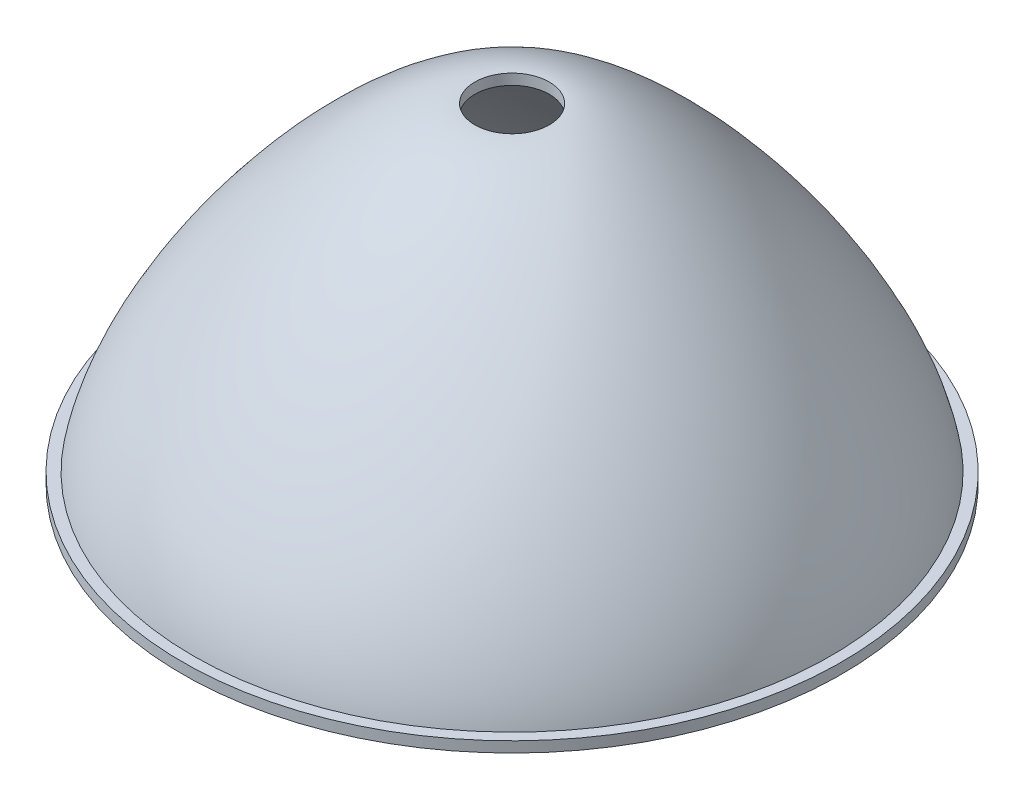
ISO-10303-21;
HEADER;
FILE_DESCRIPTION(('STEP AP214'),'2;1');
FILE_NAME('part.step','',(''),(''),'','','');
FILE_SCHEMA(('AUTOMOTIVE_DESIGN { 1 0 10303 214 1 1 1 1 }'));
ENDSEC;
DATA;
#1=APPLICATION_CONTEXT('core data for automotive mechanical design processes');
#2=APPLICATION_PROTOCOL_DEFINITION('international standard','automotive_design',2000,#1);
#3=PRODUCT_CONTEXT('',#1,'mechanical');
#4=PRODUCT('Part','Part','',(#3));
#5=PRODUCT_RELATED_PRODUCT_CATEGORY('part','',(#4));
#6=PRODUCT_DEFINITION_FORMATION('','',#4);
#7=PRODUCT_DEFINITION_CONTEXT('part definition',#1,'design');
#8=PRODUCT_DEFINITION('design','',#6,#7);
#9=PRODUCT_DEFINITION_SHAPE('','',#8);
#10=(LENGTH_UNIT() NAMED_UNIT(*) SI_UNIT(.MILLI.,.METRE.));
#11=(NAMED_UNIT(*) PLANE_ANGLE_UNIT() SI_UNIT($,.RADIAN.));
#12=(NAMED_UNIT(*) SI_UNIT($,.STERADIAN.) SOLID_ANGLE_UNIT());
#13=UNCERTAINTY_MEASURE_WITH_UNIT(LENGTH_MEASURE(1.E-05),#10,'distance_accuracy_value','');
#14=(GEOMETRIC_REPRESENTATION_CONTEXT(3) GLOBAL_UNCERTAINTY_ASSIGNED_CONTEXT((#13)) GLOBAL_UNIT_ASSIGNED_CONTEXT((#10,
#11,#12)) REPRESENTATION_CONTEXT('',''));
#15=CARTESIAN_POINT('',(0.,0.,0.));
#16=DIRECTION('',(0.,0.,1.));
#17=DIRECTION('',(1.,0.,0.));
#18=AXIS2_PLACEMENT_3D('',#15,#16,#17);
#19=CARTESIAN_POINT('',(0.,-2.,-60.));
#20=DIRECTION('',(0.,-1.,0.));
#21=DIRECTION('',(0.,0.,-1.00000000000001));
#22=AXIS2_PLACEMENT_3D('',#19,#20,#21);
#23=PLANE('',#22);
#24=CARTESIAN_POINT('',(0.,-2.,0.));
#25=DIRECTION('',(0.,-1.,0.));
#26=DIRECTION('',(0.,0.,-1.00000000000001));
#27=AXIS2_PLACEMENT_3D('',#24,#25,#26);
#28=CIRCLE('',#27,62.);
#29=CARTESIAN_POINT('',(0.,-2.,-62.0000000000004));
#30=VERTEX_POINT('',#29);
#31=EDGE_CURVE('E12',#30,#30,#28,.T.);
#32=ORIENTED_EDGE('',*,*,#31,.T.);
#33=EDGE_LOOP('',(#32));
#34=FACE_BOUND('',#33,.T.);
#35=CARTESIAN_POINT('',(0.,-2.,0.));
#36=DIRECTION('',(0.,-1.,0.));
#37=DIRECTION('',(0.,0.,-1.00000000000001));
#38=AXIS2_PLACEMENT_3D('',#35,#36,#37);
#39=CIRCLE('',#38,58.3218007376454);
#40=CARTESIAN_POINT('',(0.,-2.,-58.3218007376458));
#41=VERTEX_POINT('',#40);
#42=EDGE_CURVE('E73',#41,#41,#39,.T.);
#43=ORIENTED_EDGE('',*,*,#42,.F.);
#44=EDGE_LOOP('',(#43));
#45=FACE_BOUND('',#44,.T.);
#46=ADVANCED_FACE('F51',(#34,#45),#23,.T.);
#47=CARTESIAN_POINT('',(0.,0.,0.));
#48=DIRECTION('',(0.,-1.,0.));
#49=DIRECTION('',(0.,0.,-1.00000000000001));
#50=AXIS2_PLACEMENT_3D('',#47,#48,#49);
#51=CYLINDRICAL_SURFACE('',#50,62.);
#52=ORIENTED_EDGE('',*,*,#31,.F.);
#53=EDGE_LOOP('',(#52));
#54=FACE_BOUND('',#53,.T.);
#55=CARTESIAN_POINT('',(0.,0.,0.));
#56=DIRECTION('',(0.,-1.,0.));
#57=DIRECTION('',(0.,0.,-1.00000000000001));
#58=AXIS2_PLACEMENT_3D('',#55,#56,#57);
#59=CIRCLE('',#58,62.);
#60=CARTESIAN_POINT('',(0.,0.,-62.0000000000004));
#61=VERTEX_POINT('',#60);
#62=EDGE_CURVE('E57',#61,#61,#59,.T.);
#63=ORIENTED_EDGE('',*,*,#62,.T.);
#64=EDGE_LOOP('',(#63));
#65=FACE_BOUND('',#64,.T.);
#66=ADVANCED_FACE('F101',(#54,#65),#51,.T.);
#67=CARTESIAN_POINT('',(0.,0.,-60.));
#68=DIRECTION('',(0.,-1.,0.));
#69=DIRECTION('',(0.,0.,-1.00000000000001));
#70=AXIS2_PLACEMENT_3D('',#67,#68,#69);
#71=PLANE('',#70);
#72=ORIENTED_EDGE('',*,*,#62,.F.);
#73=EDGE_LOOP('',(#72));
#74=FACE_BOUND('',#73,.T.);
#75=CARTESIAN_POINT('',(0.,0.,0.));
#76=DIRECTION('',(0.,-1.,0.));
#77=DIRECTION('',(0.,0.,-1.00000000000001));
#78=AXIS2_PLACEMENT_3D('',#75,#76,#77);
#79=CIRCLE('',#78,60.);
#80=CARTESIAN_POINT('',(0.,0.,-60.0000000000004));
#81=VERTEX_POINT('',#80);
#82=EDGE_CURVE('E61',#81,#81,#79,.T.);
#83=ORIENTED_EDGE('',*,*,#82,.T.);
#84=EDGE_LOOP('',(#83));
#85=FACE_BOUND('',#84,.T.);
#86=ADVANCED_FACE('F98',(#74,#85),#71,.F.);
#87=CARTESIAN_POINT('',(-4.9960036108132E-13,60.,-7.00000000000087));
#88=CARTESIAN_POINT('',(-1.11022302462516E-13,60.,-23.6666666666666));
#89=CARTESIAN_POINT('',(0.,22.9788475702848,-55.9482091877716));
#90=CARTESIAN_POINT('',(0.,0.,-60.));
#91=B_SPLINE_CURVE_WITH_KNOTS('',3,(#87,#88,#89,#90),.UNSPECIFIED.,.F.,.F.,(4,4),(0.,1.),.UNSPECIFIED.);
#92=CARTESIAN_POINT('',(0.,0.,0.));
#93=DIRECTION('',(0.,-1.,0.));
#94=AXIS1_PLACEMENT('',#92,#93);
#95=SURFACE_OF_REVOLUTION('',#91,#94);
#96=ORIENTED_EDGE('',*,*,#82,.F.);
#97=EDGE_LOOP('',(#96));
#98=FACE_BOUND('',#97,.T.);
#99=CARTESIAN_POINT('',(0.,60.,0.));
#100=DIRECTION('',(0.,-1.,0.));
#101=DIRECTION('',(0.,0.,-1.00000000000001));
#102=AXIS2_PLACEMENT_3D('',#99,#100,#101);
#103=CIRCLE('',#102,6.99999999999999);
#104=CARTESIAN_POINT('',(0.,60.,-7.00000000000004));
#105=VERTEX_POINT('',#104);
#106=EDGE_CURVE('E65',#105,#105,#103,.T.);
#107=ORIENTED_EDGE('',*,*,#106,.T.);
#108=EDGE_LOOP('',(#107));
#109=FACE_BOUND('',#108,.T.);
#110=ADVANCED_FACE('F94',(#98,#109),#95,.T.);
#111=CARTESIAN_POINT('',(0.,0.,0.));
#112=DIRECTION('',(0.,-1.,0.));
#113=DIRECTION('',(0.,0.,-1.00000000000001));
#114=AXIS2_PLACEMENT_3D('',#111,#112,#113);
#115=CYLINDRICAL_SURFACE('',#114,6.99999999999999);
#116=ORIENTED_EDGE('',*,*,#106,.F.);
#117=EDGE_LOOP('',(#116));
#118=FACE_BOUND('',#117,.T.);
#119=CARTESIAN_POINT('',(0.,58.,0.));
#120=DIRECTION('',(0.,-1.,0.));
#121=DIRECTION('',(0.,0.,-1.00000000000001));
#122=AXIS2_PLACEMENT_3D('',#119,#120,#121);
#123=CIRCLE('',#122,6.99999999999999);
#124=CARTESIAN_POINT('',(0.,58.,-7.00000000000004));
#125=VERTEX_POINT('',#124);
#126=EDGE_CURVE('E70',#125,#125,#123,.T.);
#127=ORIENTED_EDGE('',*,*,#126,.T.);
#128=EDGE_LOOP('',(#127));
#129=FACE_BOUND('',#128,.T.);
#130=ADVANCED_FACE('F90',(#118,#129),#115,.F.);
#131=CARTESIAN_POINT('',(-4.9960036108132E-13,58.,-7.00000000000087));
#132=CARTESIAN_POINT('',(0.,58.,-7.87709633134845));
#133=CARTESIAN_POINT('',(-3.88578058618805E-13,57.8741038698613,-8.85075237652286));
#134=CARTESIAN_POINT('',(-4.9960036108132E-13,57.3578034987706,-10.9578978552919));
#135=CARTESIAN_POINT('',(0.,56.9678489397142,-12.0902925270122));
#136=CARTESIAN_POINT('',(-4.44089209850063E-13,55.421236720211,-15.66044027148));
#137=CARTESIAN_POINT('',(0.,53.8875411025154,-18.2680396891144));
#138=CARTESIAN_POINT('',(0.,50.0174134098447,-23.670544306904));
#139=CARTESIAN_POINT('',(0.,47.6826261480309,-26.4673803117787));
#140=CARTESIAN_POINT('',(0.,42.4355004841301,-32.0387039476553));
#141=CARTESIAN_POINT('',(0.,39.5232268035423,-34.8138360195735));
#142=CARTESIAN_POINT('',(-6.10622663543836E-13,30.2534165171395,-42.8133700433087));
#143=CARTESIAN_POINT('',(0.,23.3595201336936,-47.7112936324112));
#144=CARTESIAN_POINT('',(0.,13.3053367128149,-53.271480196932));
#145=CARTESIAN_POINT('',(-4.44089209850063E-13,10.001996917298,-54.8270635624256));
#146=CARTESIAN_POINT('',(0.,5.30495462621722,-56.5782663229943));
#147=CARTESIAN_POINT('',(-4.9960036108132E-13,3.78246738511495,-57.0650228727241));
#148=CARTESIAN_POINT('',(0.,1.58934133630823,-57.6348529316923));
#149=CARTESIAN_POINT('',(0.,0.873423513103488,-57.7981020838514));
#150=CARTESIAN_POINT('',(0.,0.000283178660520633,-57.9675315293108));
#151=CARTESIAN_POINT('',(0.,-0.173256683459078,-57.9996868499404));
#152=CARTESIAN_POINT('',(0.,-0.367223995704657,-58.0338994424582));
#153=CARTESIAN_POINT('',(0.,-0.391521079138479,-58.0381825059968));
#154=CARTESIAN_POINT('',(-5.55111512312578E-13,-0.437477619734505,-58.0462858840448));
#155=CARTESIAN_POINT('',(0.,-0.506412430628655,-58.0584409511145));
#156=CARTESIAN_POINT('',(-1.66533453693773E-13,-0.667260322714802,-58.0868027742794));
#157=CARTESIAN_POINT('',(0.,-1.17278226927126,-58.1759399327976));
#158=CARTESIAN_POINT('',(-1.66533453693773E-13,-1.63234767523168,-58.2569737132688));
#159=CARTESIAN_POINT('',(-1.11022302462516E-13,-2.,-58.3218007376455));
#160=B_SPLINE_CURVE_WITH_KNOTS('',3,(#131,#132,#133,#134,#135,#136,#137,#138,#139,#140,#141,
#142,#143,#144,#145,#146,#147,#148,#149,#150,#151,#152,#153,#154,#155,#156,#157,#158,#159),
.UNSPECIFIED.,.F.,.F.,(4,2,2,2,2,2,2,2,2,2,2,2,1,1,1,4),(0.,0.0624999999999998,0.125,
0.249999999999999,0.374999999999999,0.499999999999999,0.749999999999999,0.874999999999999,
0.937499999999999,0.968749999999999,0.976562499999999,0.977539062499999,0.978515624999999,
0.980468749999999,0.984374999999999,1.),.UNSPECIFIED.);
#161=CARTESIAN_POINT('',(0.,0.,0.));
#162=DIRECTION('',(0.,-1.,0.));
#163=AXIS1_PLACEMENT('',#161,#162);
#164=SURFACE_OF_REVOLUTION('',#160,#163);
#165=ORIENTED_EDGE('',*,*,#42,.T.);
#166=EDGE_LOOP('',(#165));
#167=FACE_BOUND('',#166,.T.);
#168=ORIENTED_EDGE('',*,*,#126,.F.);
#169=EDGE_LOOP('',(#168));
#170=FACE_BOUND('',#169,.T.);
#171=ADVANCED_FACE('F87',(#167,#170),#164,.F.);
#172=CLOSED_SHELL('',(#46,#66,#86,#110,#130,#171));
#173=MANIFOLD_SOLID_BREP('B2',#172);
#174=ADVANCED_BREP_SHAPE_REPRESENTATION('',(#18,#173),#14);
#175=SHAPE_DEFINITION_REPRESENTATION(#9,#174);
ENDSEC;
END-ISO-10303-21;
